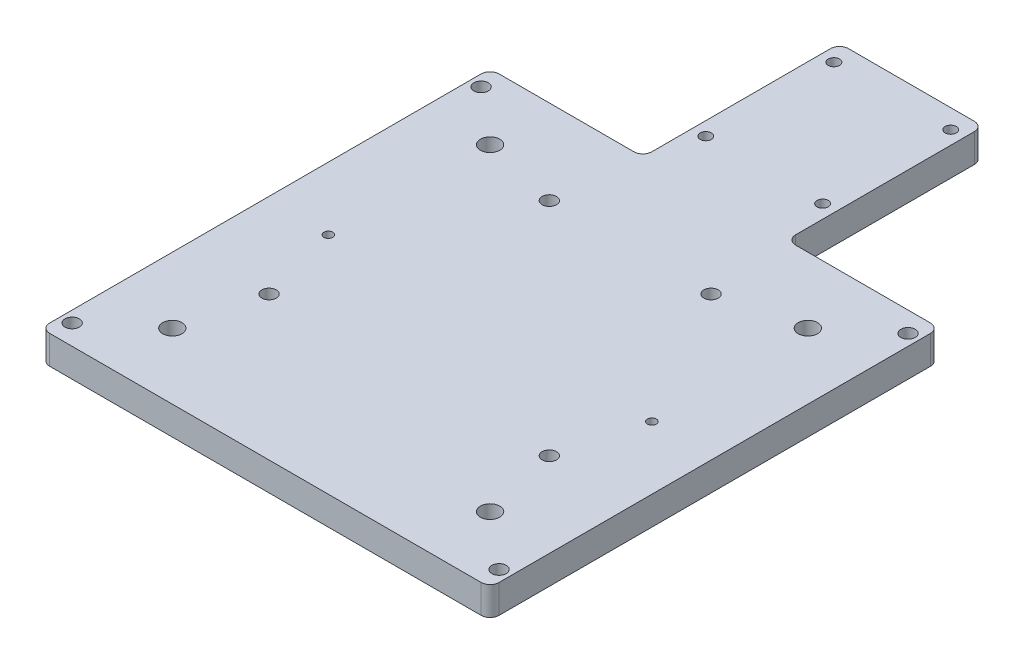
ISO-10303-21;
HEADER;
FILE_DESCRIPTION(('STEP AP214'),'2;1');
FILE_NAME('part.step','',(''),(''),'','','');
FILE_SCHEMA(('AUTOMOTIVE_DESIGN { 1 0 10303 214 1 1 1 1 }'));
ENDSEC;
DATA;
#1=APPLICATION_CONTEXT('core data for automotive mechanical design processes');
#2=APPLICATION_PROTOCOL_DEFINITION('international standard','automotive_design',2000,#1);
#3=PRODUCT_CONTEXT('',#1,'mechanical');
#4=PRODUCT('Part','Part','',(#3));
#5=PRODUCT_RELATED_PRODUCT_CATEGORY('part','',(#4));
#6=PRODUCT_DEFINITION_FORMATION('','',#4);
#7=PRODUCT_DEFINITION_CONTEXT('part definition',#1,'design');
#8=PRODUCT_DEFINITION('design','',#6,#7);
#9=PRODUCT_DEFINITION_SHAPE('','',#8);
#10=(LENGTH_UNIT() NAMED_UNIT(*) SI_UNIT(.MILLI.,.METRE.));
#11=(NAMED_UNIT(*) PLANE_ANGLE_UNIT() SI_UNIT($,.RADIAN.));
#12=(NAMED_UNIT(*) SI_UNIT($,.STERADIAN.) SOLID_ANGLE_UNIT());
#13=UNCERTAINTY_MEASURE_WITH_UNIT(LENGTH_MEASURE(1.E-05),#10,'distance_accuracy_value','');
#14=(GEOMETRIC_REPRESENTATION_CONTEXT(3) GLOBAL_UNCERTAINTY_ASSIGNED_CONTEXT((#13)) GLOBAL_UNIT_ASSIGNED_CONTEXT((#10,
#11,#12)) REPRESENTATION_CONTEXT('',''));
#15=CARTESIAN_POINT('',(0.,0.,0.));
#16=DIRECTION('',(0.,0.,1.));
#17=DIRECTION('',(1.,0.,0.));
#18=AXIS2_PLACEMENT_3D('',#15,#16,#17);
#19=CARTESIAN_POINT('',(-50.,6.35,-50.));
#20=DIRECTION('',(0.,0.,1.));
#21=DIRECTION('',(1.,0.,0.));
#22=AXIS2_PLACEMENT_3D('',#19,#20,#21);
#23=PLANE('',#22);
#24=DIRECTION('',(-1.,0.,0.));
#25=VECTOR('',#24,1.);
#26=CARTESIAN_POINT('',(-50.,6.35,-50.));
#27=LINE('',#26,#25);
#28=CARTESIAN_POINT('',(-18.,6.35,-50.));
#29=VERTEX_POINT('',#28);
#30=CARTESIAN_POINT('',(-48.,6.35,-50.));
#31=VERTEX_POINT('',#30);
#32=EDGE_CURVE('E280',#29,#31,#27,.T.);
#33=ORIENTED_EDGE('',*,*,#32,.F.);
#34=DIRECTION('',(0.,1.,0.));
#35=VECTOR('',#34,1.);
#36=CARTESIAN_POINT('',(-18.,6.35,-50.));
#37=LINE('',#36,#35);
#38=CARTESIAN_POINT('',(-18.,0.,-50.));
#39=VERTEX_POINT('',#38);
#40=EDGE_CURVE('E231',#29,#39,#37,.F.);
#41=ORIENTED_EDGE('',*,*,#40,.T.);
#42=DIRECTION('',(-1.,0.,0.));
#43=VECTOR('',#42,1.);
#44=CARTESIAN_POINT('',(-50.,0.,-50.));
#45=LINE('',#44,#43);
#46=CARTESIAN_POINT('',(-48.,0.,-50.));
#47=VERTEX_POINT('',#46);
#48=EDGE_CURVE('E180',#39,#47,#45,.T.);
#49=ORIENTED_EDGE('',*,*,#48,.T.);
#50=DIRECTION('',(0.,-1.,0.));
#51=VECTOR('',#50,1.);
#52=CARTESIAN_POINT('',(-48.,6.35,-50.));
#53=LINE('',#52,#51);
#54=EDGE_CURVE('E229',#47,#31,#53,.F.);
#55=ORIENTED_EDGE('',*,*,#54,.T.);
#56=EDGE_LOOP('',(#33,#41,#49,#55));
#57=FACE_BOUND('',#56,.T.);
#58=ADVANCED_FACE('F39',(#57),#23,.F.);
#59=CARTESIAN_POINT('',(50.,6.35,50.));
#60=DIRECTION('',(-1.,0.,0.));
#61=DIRECTION('',(0.,0.,1.));
#62=AXIS2_PLACEMENT_3D('',#59,#60,#61);
#63=PLANE('',#62);
#64=DIRECTION('',(0.,0.,-1.));
#65=VECTOR('',#64,1.);
#66=CARTESIAN_POINT('',(50.,6.35,50.));
#67=LINE('',#66,#65);
#68=CARTESIAN_POINT('',(50.,6.35,48.));
#69=VERTEX_POINT('',#68);
#70=CARTESIAN_POINT('',(50.,6.35,-48.));
#71=VERTEX_POINT('',#70);
#72=EDGE_CURVE('E173',#69,#71,#67,.T.);
#73=ORIENTED_EDGE('',*,*,#72,.F.);
#74=DIRECTION('',(0.,-1.,0.));
#75=VECTOR('',#74,1.);
#76=CARTESIAN_POINT('',(50.,6.35,48.));
#77=LINE('',#76,#75);
#78=CARTESIAN_POINT('',(50.,0.,48.));
#79=VERTEX_POINT('',#78);
#80=EDGE_CURVE('E157',#69,#79,#77,.T.);
#81=ORIENTED_EDGE('',*,*,#80,.T.);
#82=DIRECTION('',(0.,0.,-1.));
#83=VECTOR('',#82,1.);
#84=CARTESIAN_POINT('',(50.,0.,50.));
#85=LINE('',#84,#83);
#86=CARTESIAN_POINT('',(50.,0.,-48.));
#87=VERTEX_POINT('',#86);
#88=EDGE_CURVE('E170',#79,#87,#85,.T.);
#89=ORIENTED_EDGE('',*,*,#88,.T.);
#90=DIRECTION('',(0.,-1.,0.));
#91=VECTOR('',#90,1.);
#92=CARTESIAN_POINT('',(50.,6.35,-48.));
#93=LINE('',#92,#91);
#94=EDGE_CURVE('E175',#87,#71,#93,.F.);
#95=ORIENTED_EDGE('',*,*,#94,.T.);
#96=EDGE_LOOP('',(#73,#81,#89,#95));
#97=FACE_BOUND('',#96,.T.);
#98=ADVANCED_FACE('F169',(#97),#63,.F.);
#99=CARTESIAN_POINT('',(48.,0.,-50.));
#100=VERTEX_POINT('',#99);
#101=CARTESIAN_POINT('',(18.,0.,-50.));
#102=VERTEX_POINT('',#101);
#103=EDGE_CURVE('E184',#100,#102,#45,.T.);
#104=ORIENTED_EDGE('',*,*,#103,.T.);
#105=DIRECTION('',(0.,1.,0.));
#106=VECTOR('',#105,1.);
#107=CARTESIAN_POINT('',(18.,6.35,-50.));
#108=LINE('',#107,#106);
#109=CARTESIAN_POINT('',(18.,6.35,-50.));
#110=VERTEX_POINT('',#109);
#111=EDGE_CURVE('E246',#102,#110,#108,.T.);
#112=ORIENTED_EDGE('',*,*,#111,.T.);
#113=CARTESIAN_POINT('',(48.,6.35,-50.));
#114=VERTEX_POINT('',#113);
#115=EDGE_CURVE('E259',#114,#110,#27,.T.);
#116=ORIENTED_EDGE('',*,*,#115,.F.);
#117=DIRECTION('',(0.,-1.,0.));
#118=VECTOR('',#117,1.);
#119=CARTESIAN_POINT('',(48.,6.35,-50.));
#120=LINE('',#119,#118);
#121=EDGE_CURVE('E243',#114,#100,#120,.T.);
#122=ORIENTED_EDGE('',*,*,#121,.T.);
#123=EDGE_LOOP('',(#104,#112,#116,#122));
#124=FACE_BOUND('',#123,.T.);
#125=ADVANCED_FACE('F275',(#124),#23,.F.);
#126=CARTESIAN_POINT('',(-50.,6.35,50.));
#127=DIRECTION('',(1.,0.,0.));
#128=DIRECTION('',(0.,0.,-1.));
#129=AXIS2_PLACEMENT_3D('',#126,#127,#128);
#130=PLANE('',#129);
#131=DIRECTION('',(0.,0.,1.));
#132=VECTOR('',#131,1.);
#133=CARTESIAN_POINT('',(-50.,0.,50.));
#134=LINE('',#133,#132);
#135=CARTESIAN_POINT('',(-50.,0.,-48.));
#136=VERTEX_POINT('',#135);
#137=CARTESIAN_POINT('',(-50.,0.,48.));
#138=VERTEX_POINT('',#137);
#139=EDGE_CURVE('E194',#136,#138,#134,.T.);
#140=ORIENTED_EDGE('',*,*,#139,.T.);
#141=DIRECTION('',(0.,-1.,0.));
#142=VECTOR('',#141,1.);
#143=CARTESIAN_POINT('',(-50.,6.35,48.));
#144=LINE('',#143,#142);
#145=CARTESIAN_POINT('',(-50.,6.35,48.));
#146=VERTEX_POINT('',#145);
#147=EDGE_CURVE('E54',#138,#146,#144,.F.);
#148=ORIENTED_EDGE('',*,*,#147,.T.);
#149=DIRECTION('',(0.,0.,1.));
#150=VECTOR('',#149,1.);
#151=CARTESIAN_POINT('',(-50.,6.35,50.));
#152=LINE('',#151,#150);
#153=CARTESIAN_POINT('',(-50.,6.35,-48.));
#154=VERTEX_POINT('',#153);
#155=EDGE_CURVE('E284',#154,#146,#152,.T.);
#156=ORIENTED_EDGE('',*,*,#155,.F.);
#157=DIRECTION('',(0.,-1.,0.));
#158=VECTOR('',#157,1.);
#159=CARTESIAN_POINT('',(-50.,6.35,-48.));
#160=LINE('',#159,#158);
#161=EDGE_CURVE('E220',#154,#136,#160,.T.);
#162=ORIENTED_EDGE('',*,*,#161,.T.);
#163=EDGE_LOOP('',(#140,#148,#156,#162));
#164=FACE_BOUND('',#163,.T.);
#165=ADVANCED_FACE('F293',(#164),#130,.F.);
#166=CARTESIAN_POINT('',(-50.,6.35,50.));
#167=DIRECTION('',(0.,0.,-1.));
#168=DIRECTION('',(-1.,0.,0.));
#169=AXIS2_PLACEMENT_3D('',#166,#167,#168);
#170=PLANE('',#169);
#171=DIRECTION('',(1.,0.,0.));
#172=VECTOR('',#171,1.);
#173=CARTESIAN_POINT('',(-50.,0.,50.));
#174=LINE('',#173,#172);
#175=CARTESIAN_POINT('',(-48.,0.,50.));
#176=VERTEX_POINT('',#175);
#177=CARTESIAN_POINT('',(48.,0.,50.));
#178=VERTEX_POINT('',#177);
#179=EDGE_CURVE('E196',#176,#178,#174,.T.);
#180=ORIENTED_EDGE('',*,*,#179,.T.);
#181=DIRECTION('',(0.,-1.,0.));
#182=VECTOR('',#181,1.);
#183=CARTESIAN_POINT('',(48.,6.35,50.));
#184=LINE('',#183,#182);
#185=CARTESIAN_POINT('',(48.,6.35,50.));
#186=VERTEX_POINT('',#185);
#187=EDGE_CURVE('E158',#178,#186,#184,.F.);
#188=ORIENTED_EDGE('',*,*,#187,.T.);
#189=DIRECTION('',(1.,0.,0.));
#190=VECTOR('',#189,1.);
#191=CARTESIAN_POINT('',(-50.,6.35,50.));
#192=LINE('',#191,#190);
#193=CARTESIAN_POINT('',(-48.,6.35,50.));
#194=VERTEX_POINT('',#193);
#195=EDGE_CURVE('E190',#194,#186,#192,.T.);
#196=ORIENTED_EDGE('',*,*,#195,.F.);
#197=DIRECTION('',(0.,-1.,0.));
#198=VECTOR('',#197,1.);
#199=CARTESIAN_POINT('',(-48.,6.35,50.));
#200=LINE('',#199,#198);
#201=EDGE_CURVE('E163',#194,#176,#200,.T.);
#202=ORIENTED_EDGE('',*,*,#201,.T.);
#203=EDGE_LOOP('',(#180,#188,#196,#202));
#204=FACE_BOUND('',#203,.T.);
#205=ADVANCED_FACE('F289',(#204),#170,.F.);
#206=CARTESIAN_POINT('',(0.,6.35,0.));
#207=DIRECTION('',(0.,-1.,0.));
#208=DIRECTION('',(0.,0.,-1.));
#209=AXIS2_PLACEMENT_3D('',#206,#207,#208);
#210=PLANE('',#209);
#211=CARTESIAN_POINT('',(-13.,6.35,-89.5));
#212=DIRECTION('',(0.,1.,0.));
#213=DIRECTION('',(0.,0.,1.));
#214=AXIS2_PLACEMENT_3D('',#211,#212,#213);
#215=CIRCLE('',#214,1.24999999999999);
#216=CARTESIAN_POINT('',(-13.,6.35,-88.25));
#217=VERTEX_POINT('',#216);
#218=EDGE_CURVE('E432',#217,#217,#215,.T.);
#219=ORIENTED_EDGE('',*,*,#218,.F.);
#220=EDGE_LOOP('',(#219));
#221=FACE_BOUND('',#220,.T.);
#222=CARTESIAN_POINT('',(13.,6.35,-89.5));
#223=DIRECTION('',(0.,1.,0.));
#224=DIRECTION('',(0.,0.,1.));
#225=AXIS2_PLACEMENT_3D('',#222,#223,#224);
#226=CIRCLE('',#225,1.24999999999999);
#227=CARTESIAN_POINT('',(13.,6.35,-88.25));
#228=VERTEX_POINT('',#227);
#229=EDGE_CURVE('E426',#228,#228,#226,.T.);
#230=ORIENTED_EDGE('',*,*,#229,.F.);
#231=EDGE_LOOP('',(#230));
#232=FACE_BOUND('',#231,.T.);
#233=CARTESIAN_POINT('',(13.,6.35,-61.));
#234=DIRECTION('',(0.,1.,0.));
#235=DIRECTION('',(0.,0.,1.));
#236=AXIS2_PLACEMENT_3D('',#233,#234,#235);
#237=CIRCLE('',#236,1.24999999999999);
#238=CARTESIAN_POINT('',(13.,6.35,-59.75));
#239=VERTEX_POINT('',#238);
#240=EDGE_CURVE('E420',#239,#239,#237,.T.);
#241=ORIENTED_EDGE('',*,*,#240,.F.);
#242=EDGE_LOOP('',(#241));
#243=FACE_BOUND('',#242,.T.);
#244=CARTESIAN_POINT('',(-13.,6.35,-61.));
#245=DIRECTION('',(0.,1.,0.));
#246=DIRECTION('',(0.,0.,1.));
#247=AXIS2_PLACEMENT_3D('',#244,#245,#246);
#248=CIRCLE('',#247,1.24999999999999);
#249=CARTESIAN_POINT('',(-13.,6.35,-59.75));
#250=VERTEX_POINT('',#249);
#251=EDGE_CURVE('E414',#250,#250,#248,.T.);
#252=ORIENTED_EDGE('',*,*,#251,.F.);
#253=EDGE_LOOP('',(#252));
#254=FACE_BOUND('',#253,.T.);
#255=CARTESIAN_POINT('',(-35.355,6.35,35.355));
#256=DIRECTION('',(0.,1.,0.));
#257=DIRECTION('',(0.,0.,1.));
#258=AXIS2_PLACEMENT_3D('',#255,#256,#257);
#259=CIRCLE('',#258,2.15);
#260=CARTESIAN_POINT('',(-35.355,6.35,37.505));
#261=VERTEX_POINT('',#260);
#262=EDGE_CURVE('E408',#261,#261,#259,.T.);
#263=ORIENTED_EDGE('',*,*,#262,.F.);
#264=EDGE_LOOP('',(#263));
#265=FACE_BOUND('',#264,.T.);
#266=CARTESIAN_POINT('',(-35.355,6.35,-35.355));
#267=DIRECTION('',(0.,1.,0.));
#268=DIRECTION('',(0.,0.,1.));
#269=AXIS2_PLACEMENT_3D('',#266,#267,#268);
#270=CIRCLE('',#269,2.15);
#271=CARTESIAN_POINT('',(-35.355,6.35,-33.205));
#272=VERTEX_POINT('',#271);
#273=EDGE_CURVE('E402',#272,#272,#270,.T.);
#274=ORIENTED_EDGE('',*,*,#273,.F.);
#275=EDGE_LOOP('',(#274));
#276=FACE_BOUND('',#275,.T.);
#277=CARTESIAN_POINT('',(35.355,6.35,-35.355));
#278=DIRECTION('',(0.,1.,0.));
#279=DIRECTION('',(0.,0.,1.));
#280=AXIS2_PLACEMENT_3D('',#277,#278,#279);
#281=CIRCLE('',#280,2.15);
#282=CARTESIAN_POINT('',(35.355,6.35,-33.205));
#283=VERTEX_POINT('',#282);
#284=EDGE_CURVE('E396',#283,#283,#281,.T.);
#285=ORIENTED_EDGE('',*,*,#284,.F.);
#286=EDGE_LOOP('',(#285));
#287=FACE_BOUND('',#286,.T.);
#288=CARTESIAN_POINT('',(35.355,6.35,35.355));
#289=DIRECTION('',(0.,1.,0.));
#290=DIRECTION('',(0.,0.,1.));
#291=AXIS2_PLACEMENT_3D('',#288,#289,#290);
#292=CIRCLE('',#291,2.15);
#293=CARTESIAN_POINT('',(35.355,6.35,37.505));
#294=VERTEX_POINT('',#293);
#295=EDGE_CURVE('E390',#294,#294,#292,.T.);
#296=ORIENTED_EDGE('',*,*,#295,.F.);
#297=EDGE_LOOP('',(#296));
#298=FACE_BOUND('',#297,.T.);
#299=CARTESIAN_POINT('',(-47.5,6.35,-45.5));
#300=DIRECTION('',(0.,1.,0.));
#301=DIRECTION('',(0.,0.,1.));
#302=AXIS2_PLACEMENT_3D('',#299,#300,#301);
#303=CIRCLE('',#302,1.6);
#304=CARTESIAN_POINT('',(-47.5,6.35,-43.9));
#305=VERTEX_POINT('',#304);
#306=EDGE_CURVE('E384',#305,#305,#303,.T.);
#307=ORIENTED_EDGE('',*,*,#306,.F.);
#308=EDGE_LOOP('',(#307));
#309=FACE_BOUND('',#308,.T.);
#310=CARTESIAN_POINT('',(47.5,6.35,-45.5));
#311=DIRECTION('',(0.,1.,0.));
#312=DIRECTION('',(0.,0.,1.));
#313=AXIS2_PLACEMENT_3D('',#310,#311,#312);
#314=CIRCLE('',#313,1.6);
#315=CARTESIAN_POINT('',(47.5,6.35,-43.9));
#316=VERTEX_POINT('',#315);
#317=EDGE_CURVE('E378',#316,#316,#314,.T.);
#318=ORIENTED_EDGE('',*,*,#317,.F.);
#319=EDGE_LOOP('',(#318));
#320=FACE_BOUND('',#319,.T.);
#321=CARTESIAN_POINT('',(47.5,6.35,45.5));
#322=DIRECTION('',(0.,1.,0.));
#323=DIRECTION('',(0.,0.,1.));
#324=AXIS2_PLACEMENT_3D('',#321,#322,#323);
#325=CIRCLE('',#324,1.6);
#326=CARTESIAN_POINT('',(47.5,6.35,47.1));
#327=VERTEX_POINT('',#326);
#328=EDGE_CURVE('E372',#327,#327,#325,.T.);
#329=ORIENTED_EDGE('',*,*,#328,.F.);
#330=EDGE_LOOP('',(#329));
#331=FACE_BOUND('',#330,.T.);
#332=CARTESIAN_POINT('',(-47.5,6.35,45.5));
#333=DIRECTION('',(0.,1.,0.));
#334=DIRECTION('',(0.,0.,1.));
#335=AXIS2_PLACEMENT_3D('',#332,#333,#334);
#336=CIRCLE('',#335,1.6);
#337=CARTESIAN_POINT('',(-47.5,6.35,47.1));
#338=VERTEX_POINT('',#337);
#339=EDGE_CURVE('E366',#338,#338,#336,.T.);
#340=ORIENTED_EDGE('',*,*,#339,.F.);
#341=EDGE_LOOP('',(#340));
#342=FACE_BOUND('',#341,.T.);
#343=CARTESIAN_POINT('',(-31.1769145362398,6.35,18.));
#344=DIRECTION('',(0.,1.,0.));
#345=DIRECTION('',(0.,0.,1.));
#346=AXIS2_PLACEMENT_3D('',#343,#344,#345);
#347=CIRCLE('',#346,1.6);
#348=CARTESIAN_POINT('',(-31.1769145362398,6.35,19.6000000000001));
#349=VERTEX_POINT('',#348);
#350=EDGE_CURVE('E360',#349,#349,#347,.T.);
#351=ORIENTED_EDGE('',*,*,#350,.F.);
#352=EDGE_LOOP('',(#351));
#353=FACE_BOUND('',#352,.T.);
#354=CARTESIAN_POINT('',(31.1769145362398,6.35,18.));
#355=DIRECTION('',(0.,1.,0.));
#356=DIRECTION('',(0.,0.,1.));
#357=AXIS2_PLACEMENT_3D('',#354,#355,#356);
#358=CIRCLE('',#357,1.6);
#359=CARTESIAN_POINT('',(31.1769145362398,6.35,19.6));
#360=VERTEX_POINT('',#359);
#361=EDGE_CURVE('E354',#360,#360,#358,.T.);
#362=ORIENTED_EDGE('',*,*,#361,.F.);
#363=EDGE_LOOP('',(#362));
#364=FACE_BOUND('',#363,.T.);
#365=CARTESIAN_POINT('',(18.,6.35,-31.1769145362398));
#366=DIRECTION('',(0.,1.,0.));
#367=DIRECTION('',(0.,0.,1.));
#368=AXIS2_PLACEMENT_3D('',#365,#366,#367);
#369=CIRCLE('',#368,1.6);
#370=CARTESIAN_POINT('',(18.,6.35,-29.5769145362398));
#371=VERTEX_POINT('',#370);
#372=EDGE_CURVE('E348',#371,#371,#369,.T.);
#373=ORIENTED_EDGE('',*,*,#372,.F.);
#374=EDGE_LOOP('',(#373));
#375=FACE_BOUND('',#374,.T.);
#376=CARTESIAN_POINT('',(-17.9999999999999,6.35,-31.1769145362398));
#377=DIRECTION('',(0.,1.,0.));
#378=DIRECTION('',(0.,0.,1.));
#379=AXIS2_PLACEMENT_3D('',#376,#377,#378);
#380=CIRCLE('',#379,1.6);
#381=CARTESIAN_POINT('',(-17.9999999999999,6.35,-29.5769145362398));
#382=VERTEX_POINT('',#381);
#383=EDGE_CURVE('E342',#382,#382,#380,.T.);
#384=ORIENTED_EDGE('',*,*,#383,.F.);
#385=EDGE_LOOP('',(#384));
#386=FACE_BOUND('',#385,.T.);
#387=CARTESIAN_POINT('',(-36.,6.35,0.));
#388=DIRECTION('',(0.,1.,0.));
#389=DIRECTION('',(0.,0.,1.));
#390=AXIS2_PLACEMENT_3D('',#387,#388,#389);
#391=CIRCLE('',#390,0.991869999999997);
#392=CARTESIAN_POINT('',(-36.,6.35,0.991869999999997));
#393=VERTEX_POINT('',#392);
#394=EDGE_CURVE('E335',#393,#393,#391,.T.);
#395=ORIENTED_EDGE('',*,*,#394,.F.);
#396=EDGE_LOOP('',(#395));
#397=FACE_BOUND('',#396,.T.);
#398=CARTESIAN_POINT('',(36.,6.35,0.));
#399=DIRECTION('',(0.,1.,0.));
#400=DIRECTION('',(0.,0.,1.));
#401=AXIS2_PLACEMENT_3D('',#398,#399,#400);
#402=CIRCLE('',#401,0.991869999999997);
#403=CARTESIAN_POINT('',(36.,6.35,0.991869999999997));
#404=VERTEX_POINT('',#403);
#405=EDGE_CURVE('E331',#404,#404,#402,.T.);
#406=ORIENTED_EDGE('',*,*,#405,.F.);
#407=EDGE_LOOP('',(#406));
#408=FACE_BOUND('',#407,.T.);
#409=ORIENTED_EDGE('',*,*,#195,.T.);
#410=CARTESIAN_POINT('',(48.,6.35,48.));
#411=DIRECTION('',(0.,-1.,0.));
#412=DIRECTION('',(0.,0.,-1.));
#413=AXIS2_PLACEMENT_3D('',#410,#411,#412);
#414=CIRCLE('',#413,2.);
#415=EDGE_CURVE('E218',#186,#69,#414,.F.);
#416=ORIENTED_EDGE('',*,*,#415,.T.);
#417=ORIENTED_EDGE('',*,*,#72,.T.);
#418=CARTESIAN_POINT('',(48.,6.35,-48.));
#419=DIRECTION('',(0.,-1.,0.));
#420=DIRECTION('',(0.,0.,-1.));
#421=AXIS2_PLACEMENT_3D('',#418,#419,#420);
#422=CIRCLE('',#421,2.);
#423=EDGE_CURVE('E210',#71,#114,#422,.F.);
#424=ORIENTED_EDGE('',*,*,#423,.T.);
#425=ORIENTED_EDGE('',*,*,#115,.T.);
#426=CARTESIAN_POINT('',(18.,6.35,-52.));
#427=DIRECTION('',(0.,-1.,0.));
#428=DIRECTION('',(0.,0.,-1.));
#429=AXIS2_PLACEMENT_3D('',#426,#427,#428);
#430=CIRCLE('',#429,2.);
#431=CARTESIAN_POINT('',(16.,6.35,-52.));
#432=VERTEX_POINT('',#431);
#433=EDGE_CURVE('E47',#110,#432,#430,.T.);
#434=ORIENTED_EDGE('',*,*,#433,.T.);
#435=DIRECTION('',(0.,0.,-1.));
#436=VECTOR('',#435,1.);
#437=CARTESIAN_POINT('',(16.,6.35,-93.75));
#438=LINE('',#437,#436);
#439=CARTESIAN_POINT('',(16.,6.35,-91.75));
#440=VERTEX_POINT('',#439);
#441=EDGE_CURVE('E257',#432,#440,#438,.T.);
#442=ORIENTED_EDGE('',*,*,#441,.T.);
#443=CARTESIAN_POINT('',(14.,6.35,-91.75));
#444=DIRECTION('',(0.,-1.,0.));
#445=DIRECTION('',(0.,0.,-1.));
#446=AXIS2_PLACEMENT_3D('',#443,#444,#445);
#447=CIRCLE('',#446,2.);
#448=CARTESIAN_POINT('',(14.,6.35,-93.75));
#449=VERTEX_POINT('',#448);
#450=EDGE_CURVE('E212',#440,#449,#447,.F.);
#451=ORIENTED_EDGE('',*,*,#450,.T.);
#452=DIRECTION('',(-1.,0.,0.));
#453=VECTOR('',#452,1.);
#454=CARTESIAN_POINT('',(-16.,6.35,-93.75));
#455=LINE('',#454,#453);
#456=CARTESIAN_POINT('',(-14.,6.35,-93.75));
#457=VERTEX_POINT('',#456);
#458=EDGE_CURVE('E268',#449,#457,#455,.T.);
#459=ORIENTED_EDGE('',*,*,#458,.T.);
#460=CARTESIAN_POINT('',(-14.,6.35,-91.75));
#461=DIRECTION('',(0.,-1.,0.));
#462=DIRECTION('',(0.,0.,-1.));
#463=AXIS2_PLACEMENT_3D('',#460,#461,#462);
#464=CIRCLE('',#463,2.);
#465=CARTESIAN_POINT('',(-16.,6.35,-91.75));
#466=VERTEX_POINT('',#465);
#467=EDGE_CURVE('E214',#457,#466,#464,.F.);
#468=ORIENTED_EDGE('',*,*,#467,.T.);
#469=DIRECTION('',(0.,0.,1.));
#470=VECTOR('',#469,1.);
#471=CARTESIAN_POINT('',(-16.,6.35,-50.));
#472=LINE('',#471,#470);
#473=CARTESIAN_POINT('',(-16.,6.35,-52.));
#474=VERTEX_POINT('',#473);
#475=EDGE_CURVE('E312',#466,#474,#472,.T.);
#476=ORIENTED_EDGE('',*,*,#475,.T.);
#477=CARTESIAN_POINT('',(-18.,6.35,-52.));
#478=DIRECTION('',(0.,-1.,0.));
#479=DIRECTION('',(0.,0.,-1.));
#480=AXIS2_PLACEMENT_3D('',#477,#478,#479);
#481=CIRCLE('',#480,2.);
#482=EDGE_CURVE('E249',#474,#29,#481,.T.);
#483=ORIENTED_EDGE('',*,*,#482,.T.);
#484=ORIENTED_EDGE('',*,*,#32,.T.);
#485=CARTESIAN_POINT('',(-48.,6.35,-48.));
#486=DIRECTION('',(0.,-1.,0.));
#487=DIRECTION('',(0.,0.,-1.));
#488=AXIS2_PLACEMENT_3D('',#485,#486,#487);
#489=CIRCLE('',#488,2.);
#490=EDGE_CURVE('E61',#31,#154,#489,.F.);
#491=ORIENTED_EDGE('',*,*,#490,.T.);
#492=ORIENTED_EDGE('',*,*,#155,.T.);
#493=CARTESIAN_POINT('',(-48.,6.35,48.));
#494=DIRECTION('',(0.,-1.,0.));
#495=DIRECTION('',(0.,0.,-1.));
#496=AXIS2_PLACEMENT_3D('',#493,#494,#495);
#497=CIRCLE('',#496,2.);
#498=EDGE_CURVE('E216',#146,#194,#497,.F.);
#499=ORIENTED_EDGE('',*,*,#498,.T.);
#500=EDGE_LOOP('',(#409,#416,#417,#424,#425,#434,#442,#451,#459,#468,#476,#483,#484,#491,#492,#499));
#501=FACE_BOUND('',#500,.T.);
#502=ADVANCED_FACE('F256',(#221,#232,#243,#254,#265,#276,#287,#298,#309,#320,#331,#342,#353,
#364,#375,#386,#397,#408,#501),#210,.F.);
#503=CARTESIAN_POINT('',(0.,0.,0.));
#504=DIRECTION('',(0.,-1.,0.));
#505=DIRECTION('',(0.,0.,-1.));
#506=AXIS2_PLACEMENT_3D('',#503,#504,#505);
#507=PLANE('',#506);
#508=CARTESIAN_POINT('',(-13.,0.,-89.5));
#509=DIRECTION('',(0.,1.,0.));
#510=DIRECTION('',(0.,0.,1.));
#511=AXIS2_PLACEMENT_3D('',#508,#509,#510);
#512=CIRCLE('',#511,1.24999999999999);
#513=CARTESIAN_POINT('',(-13.,0.,-88.25));
#514=VERTEX_POINT('',#513);
#515=EDGE_CURVE('E429',#514,#514,#512,.T.);
#516=ORIENTED_EDGE('',*,*,#515,.T.);
#517=EDGE_LOOP('',(#516));
#518=FACE_BOUND('',#517,.T.);
#519=CARTESIAN_POINT('',(13.,0.,-89.5));
#520=DIRECTION('',(0.,1.,0.));
#521=DIRECTION('',(0.,0.,1.));
#522=AXIS2_PLACEMENT_3D('',#519,#520,#521);
#523=CIRCLE('',#522,1.24999999999999);
#524=CARTESIAN_POINT('',(13.,0.,-88.25));
#525=VERTEX_POINT('',#524);
#526=EDGE_CURVE('E423',#525,#525,#523,.T.);
#527=ORIENTED_EDGE('',*,*,#526,.T.);
#528=EDGE_LOOP('',(#527));
#529=FACE_BOUND('',#528,.T.);
#530=CARTESIAN_POINT('',(13.,0.,-61.));
#531=DIRECTION('',(0.,1.,0.));
#532=DIRECTION('',(0.,0.,1.));
#533=AXIS2_PLACEMENT_3D('',#530,#531,#532);
#534=CIRCLE('',#533,1.24999999999999);
#535=CARTESIAN_POINT('',(13.,0.,-59.75));
#536=VERTEX_POINT('',#535);
#537=EDGE_CURVE('E417',#536,#536,#534,.T.);
#538=ORIENTED_EDGE('',*,*,#537,.T.);
#539=EDGE_LOOP('',(#538));
#540=FACE_BOUND('',#539,.T.);
#541=CARTESIAN_POINT('',(-13.,0.,-61.));
#542=DIRECTION('',(0.,1.,0.));
#543=DIRECTION('',(0.,0.,1.));
#544=AXIS2_PLACEMENT_3D('',#541,#542,#543);
#545=CIRCLE('',#544,1.24999999999999);
#546=CARTESIAN_POINT('',(-13.,0.,-59.75));
#547=VERTEX_POINT('',#546);
#548=EDGE_CURVE('E411',#547,#547,#545,.T.);
#549=ORIENTED_EDGE('',*,*,#548,.T.);
#550=EDGE_LOOP('',(#549));
#551=FACE_BOUND('',#550,.T.);
#552=CARTESIAN_POINT('',(-35.355,0.,35.355));
#553=DIRECTION('',(0.,1.,0.));
#554=DIRECTION('',(0.,0.,1.));
#555=AXIS2_PLACEMENT_3D('',#552,#553,#554);
#556=CIRCLE('',#555,2.15);
#557=CARTESIAN_POINT('',(-35.355,0.,37.505));
#558=VERTEX_POINT('',#557);
#559=EDGE_CURVE('E405',#558,#558,#556,.T.);
#560=ORIENTED_EDGE('',*,*,#559,.T.);
#561=EDGE_LOOP('',(#560));
#562=FACE_BOUND('',#561,.T.);
#563=CARTESIAN_POINT('',(-35.355,0.,-35.355));
#564=DIRECTION('',(0.,1.,0.));
#565=DIRECTION('',(0.,0.,1.));
#566=AXIS2_PLACEMENT_3D('',#563,#564,#565);
#567=CIRCLE('',#566,2.15);
#568=CARTESIAN_POINT('',(-35.355,0.,-33.205));
#569=VERTEX_POINT('',#568);
#570=EDGE_CURVE('E399',#569,#569,#567,.T.);
#571=ORIENTED_EDGE('',*,*,#570,.T.);
#572=EDGE_LOOP('',(#571));
#573=FACE_BOUND('',#572,.T.);
#574=CARTESIAN_POINT('',(35.355,0.,-35.355));
#575=DIRECTION('',(0.,1.,0.));
#576=DIRECTION('',(0.,0.,1.));
#577=AXIS2_PLACEMENT_3D('',#574,#575,#576);
#578=CIRCLE('',#577,2.15);
#579=CARTESIAN_POINT('',(35.355,0.,-33.205));
#580=VERTEX_POINT('',#579);
#581=EDGE_CURVE('E393',#580,#580,#578,.T.);
#582=ORIENTED_EDGE('',*,*,#581,.T.);
#583=EDGE_LOOP('',(#582));
#584=FACE_BOUND('',#583,.T.);
#585=CARTESIAN_POINT('',(35.355,0.,35.355));
#586=DIRECTION('',(0.,1.,0.));
#587=DIRECTION('',(0.,0.,1.));
#588=AXIS2_PLACEMENT_3D('',#585,#586,#587);
#589=CIRCLE('',#588,2.15);
#590=CARTESIAN_POINT('',(35.355,0.,37.505));
#591=VERTEX_POINT('',#590);
#592=EDGE_CURVE('E387',#591,#591,#589,.T.);
#593=ORIENTED_EDGE('',*,*,#592,.T.);
#594=EDGE_LOOP('',(#593));
#595=FACE_BOUND('',#594,.T.);
#596=CARTESIAN_POINT('',(-47.5,0.,-45.5));
#597=DIRECTION('',(0.,1.,0.));
#598=DIRECTION('',(0.,0.,1.));
#599=AXIS2_PLACEMENT_3D('',#596,#597,#598);
#600=CIRCLE('',#599,1.6);
#601=CARTESIAN_POINT('',(-47.5,0.,-43.9));
#602=VERTEX_POINT('',#601);
#603=EDGE_CURVE('E381',#602,#602,#600,.T.);
#604=ORIENTED_EDGE('',*,*,#603,.T.);
#605=EDGE_LOOP('',(#604));
#606=FACE_BOUND('',#605,.T.);
#607=CARTESIAN_POINT('',(47.5,0.,-45.5));
#608=DIRECTION('',(0.,1.,0.));
#609=DIRECTION('',(0.,0.,1.));
#610=AXIS2_PLACEMENT_3D('',#607,#608,#609);
#611=CIRCLE('',#610,1.6);
#612=CARTESIAN_POINT('',(47.5,0.,-43.9));
#613=VERTEX_POINT('',#612);
#614=EDGE_CURVE('E375',#613,#613,#611,.T.);
#615=ORIENTED_EDGE('',*,*,#614,.T.);
#616=EDGE_LOOP('',(#615));
#617=FACE_BOUND('',#616,.T.);
#618=CARTESIAN_POINT('',(47.5,0.,45.5));
#619=DIRECTION('',(0.,1.,0.));
#620=DIRECTION('',(0.,0.,1.));
#621=AXIS2_PLACEMENT_3D('',#618,#619,#620);
#622=CIRCLE('',#621,1.6);
#623=CARTESIAN_POINT('',(47.5,0.,47.1));
#624=VERTEX_POINT('',#623);
#625=EDGE_CURVE('E369',#624,#624,#622,.T.);
#626=ORIENTED_EDGE('',*,*,#625,.T.);
#627=EDGE_LOOP('',(#626));
#628=FACE_BOUND('',#627,.T.);
#629=CARTESIAN_POINT('',(-47.5,0.,45.5));
#630=DIRECTION('',(0.,1.,0.));
#631=DIRECTION('',(0.,0.,1.));
#632=AXIS2_PLACEMENT_3D('',#629,#630,#631);
#633=CIRCLE('',#632,1.6);
#634=CARTESIAN_POINT('',(-47.5,0.,47.1));
#635=VERTEX_POINT('',#634);
#636=EDGE_CURVE('E363',#635,#635,#633,.T.);
#637=ORIENTED_EDGE('',*,*,#636,.T.);
#638=EDGE_LOOP('',(#637));
#639=FACE_BOUND('',#638,.T.);
#640=CARTESIAN_POINT('',(-31.1769145362398,0.,18.));
#641=DIRECTION('',(0.,1.,0.));
#642=DIRECTION('',(0.,0.,1.));
#643=AXIS2_PLACEMENT_3D('',#640,#641,#642);
#644=CIRCLE('',#643,1.6);
#645=CARTESIAN_POINT('',(-31.1769145362398,0.,19.6));
#646=VERTEX_POINT('',#645);
#647=EDGE_CURVE('E357',#646,#646,#644,.T.);
#648=ORIENTED_EDGE('',*,*,#647,.T.);
#649=EDGE_LOOP('',(#648));
#650=FACE_BOUND('',#649,.T.);
#651=CARTESIAN_POINT('',(31.1769145362398,0.,18.));
#652=DIRECTION('',(0.,1.,0.));
#653=DIRECTION('',(0.,0.,1.));
#654=AXIS2_PLACEMENT_3D('',#651,#652,#653);
#655=CIRCLE('',#654,1.6);
#656=CARTESIAN_POINT('',(31.1769145362398,0.,19.6));
#657=VERTEX_POINT('',#656);
#658=EDGE_CURVE('E351',#657,#657,#655,.T.);
#659=ORIENTED_EDGE('',*,*,#658,.T.);
#660=EDGE_LOOP('',(#659));
#661=FACE_BOUND('',#660,.T.);
#662=CARTESIAN_POINT('',(18.,0.,-31.1769145362398));
#663=DIRECTION('',(0.,1.,0.));
#664=DIRECTION('',(0.,0.,1.));
#665=AXIS2_PLACEMENT_3D('',#662,#663,#664);
#666=CIRCLE('',#665,1.6);
#667=CARTESIAN_POINT('',(18.,0.,-29.5769145362398));
#668=VERTEX_POINT('',#667);
#669=EDGE_CURVE('E345',#668,#668,#666,.T.);
#670=ORIENTED_EDGE('',*,*,#669,.T.);
#671=EDGE_LOOP('',(#670));
#672=FACE_BOUND('',#671,.T.);
#673=CARTESIAN_POINT('',(-17.9999999999999,0.,-31.1769145362398));
#674=DIRECTION('',(0.,1.,0.));
#675=DIRECTION('',(0.,0.,1.));
#676=AXIS2_PLACEMENT_3D('',#673,#674,#675);
#677=CIRCLE('',#676,1.6);
#678=CARTESIAN_POINT('',(-17.9999999999999,0.,-29.5769145362398));
#679=VERTEX_POINT('',#678);
#680=EDGE_CURVE('E332',#679,#679,#677,.T.);
#681=ORIENTED_EDGE('',*,*,#680,.T.);
#682=EDGE_LOOP('',(#681));
#683=FACE_BOUND('',#682,.T.);
#684=CARTESIAN_POINT('',(-36.,0.,0.));
#685=DIRECTION('',(0.,1.,0.));
#686=DIRECTION('',(0.,0.,1.));
#687=AXIS2_PLACEMENT_3D('',#684,#685,#686);
#688=CIRCLE('',#687,0.991869999999997);
#689=CARTESIAN_POINT('',(-36.,0.,0.991869999999997));
#690=VERTEX_POINT('',#689);
#691=EDGE_CURVE('E269',#690,#690,#688,.T.);
#692=ORIENTED_EDGE('',*,*,#691,.T.);
#693=EDGE_LOOP('',(#692));
#694=FACE_BOUND('',#693,.T.);
#695=CARTESIAN_POINT('',(36.,0.,0.));
#696=DIRECTION('',(0.,1.,0.));
#697=DIRECTION('',(0.,0.,1.));
#698=AXIS2_PLACEMENT_3D('',#695,#696,#697);
#699=CIRCLE('',#698,0.991869999999997);
#700=CARTESIAN_POINT('',(36.,0.,0.991869999999997));
#701=VERTEX_POINT('',#700);
#702=EDGE_CURVE('E328',#701,#701,#699,.T.);
#703=ORIENTED_EDGE('',*,*,#702,.T.);
#704=EDGE_LOOP('',(#703));
#705=FACE_BOUND('',#704,.T.);
#706=ORIENTED_EDGE('',*,*,#88,.F.);
#707=CARTESIAN_POINT('',(48.,0.,48.));
#708=DIRECTION('',(0.,-1.,0.));
#709=DIRECTION('',(0.,0.,-1.));
#710=AXIS2_PLACEMENT_3D('',#707,#708,#709);
#711=CIRCLE('',#710,2.);
#712=EDGE_CURVE('E153',#79,#178,#711,.T.);
#713=ORIENTED_EDGE('',*,*,#712,.T.);
#714=ORIENTED_EDGE('',*,*,#179,.F.);
#715=CARTESIAN_POINT('',(-48.,0.,48.));
#716=DIRECTION('',(0.,-1.,0.));
#717=DIRECTION('',(0.,0.,-1.));
#718=AXIS2_PLACEMENT_3D('',#715,#716,#717);
#719=CIRCLE('',#718,2.);
#720=EDGE_CURVE('E164',#176,#138,#719,.T.);
#721=ORIENTED_EDGE('',*,*,#720,.T.);
#722=ORIENTED_EDGE('',*,*,#139,.F.);
#723=CARTESIAN_POINT('',(-48.,0.,-48.));
#724=DIRECTION('',(0.,-1.,0.));
#725=DIRECTION('',(0.,0.,-1.));
#726=AXIS2_PLACEMENT_3D('',#723,#724,#725);
#727=CIRCLE('',#726,2.);
#728=EDGE_CURVE('E174',#136,#47,#727,.T.);
#729=ORIENTED_EDGE('',*,*,#728,.T.);
#730=ORIENTED_EDGE('',*,*,#48,.F.);
#731=CARTESIAN_POINT('',(-18.,0.,-52.));
#732=DIRECTION('',(0.,-1.,0.));
#733=DIRECTION('',(0.,0.,-1.));
#734=AXIS2_PLACEMENT_3D('',#731,#732,#733);
#735=CIRCLE('',#734,2.);
#736=CARTESIAN_POINT('',(-16.,0.,-52.));
#737=VERTEX_POINT('',#736);
#738=EDGE_CURVE('E251',#39,#737,#735,.F.);
#739=ORIENTED_EDGE('',*,*,#738,.T.);
#740=DIRECTION('',(0.,0.,1.));
#741=VECTOR('',#740,1.);
#742=CARTESIAN_POINT('',(-16.,0.,-50.));
#743=LINE('',#742,#741);
#744=CARTESIAN_POINT('',(-16.,0.,-91.75));
#745=VERTEX_POINT('',#744);
#746=EDGE_CURVE('E181',#745,#737,#743,.T.);
#747=ORIENTED_EDGE('',*,*,#746,.F.);
#748=CARTESIAN_POINT('',(-14.,0.,-91.75));
#749=DIRECTION('',(0.,-1.,0.));
#750=DIRECTION('',(0.,0.,-1.));
#751=AXIS2_PLACEMENT_3D('',#748,#749,#750);
#752=CIRCLE('',#751,2.);
#753=CARTESIAN_POINT('',(-14.,0.,-93.75));
#754=VERTEX_POINT('',#753);
#755=EDGE_CURVE('E203',#745,#754,#752,.T.);
#756=ORIENTED_EDGE('',*,*,#755,.T.);
#757=DIRECTION('',(-1.,0.,0.));
#758=VECTOR('',#757,1.);
#759=CARTESIAN_POINT('',(-16.,0.,-93.75));
#760=LINE('',#759,#758);
#761=CARTESIAN_POINT('',(14.,0.,-93.75));
#762=VERTEX_POINT('',#761);
#763=EDGE_CURVE('E187',#762,#754,#760,.T.);
#764=ORIENTED_EDGE('',*,*,#763,.F.);
#765=CARTESIAN_POINT('',(14.,0.,-91.75));
#766=DIRECTION('',(0.,-1.,0.));
#767=DIRECTION('',(0.,0.,-1.));
#768=AXIS2_PLACEMENT_3D('',#765,#766,#767);
#769=CIRCLE('',#768,2.);
#770=CARTESIAN_POINT('',(16.,0.,-91.75));
#771=VERTEX_POINT('',#770);
#772=EDGE_CURVE('E201',#762,#771,#769,.T.);
#773=ORIENTED_EDGE('',*,*,#772,.T.);
#774=DIRECTION('',(0.,0.,-1.));
#775=VECTOR('',#774,1.);
#776=CARTESIAN_POINT('',(16.,0.,-93.75));
#777=LINE('',#776,#775);
#778=CARTESIAN_POINT('',(16.,0.,-52.));
#779=VERTEX_POINT('',#778);
#780=EDGE_CURVE('E273',#779,#771,#777,.T.);
#781=ORIENTED_EDGE('',*,*,#780,.F.);
#782=CARTESIAN_POINT('',(18.,0.,-52.));
#783=DIRECTION('',(0.,-1.,0.));
#784=DIRECTION('',(0.,0.,-1.));
#785=AXIS2_PLACEMENT_3D('',#782,#783,#784);
#786=CIRCLE('',#785,2.);
#787=EDGE_CURVE('E11',#779,#102,#786,.F.);
#788=ORIENTED_EDGE('',*,*,#787,.T.);
#789=ORIENTED_EDGE('',*,*,#103,.F.);
#790=CARTESIAN_POINT('',(48.,0.,-48.));
#791=DIRECTION('',(0.,-1.,0.));
#792=DIRECTION('',(0.,0.,-1.));
#793=AXIS2_PLACEMENT_3D('',#790,#791,#792);
#794=CIRCLE('',#793,2.);
#795=EDGE_CURVE('E179',#100,#87,#794,.T.);
#796=ORIENTED_EDGE('',*,*,#795,.T.);
#797=EDGE_LOOP('',(#706,#713,#714,#721,#722,#729,#730,#739,#747,#756,#764,#773,#781,#788,#789,#796));
#798=FACE_BOUND('',#797,.T.);
#799=ADVANCED_FACE('F177',(#518,#529,#540,#551,#562,#573,#584,#595,#606,#617,#628,#639,#650,
#661,#672,#683,#694,#705,#798),#507,.T.);
#800=CARTESIAN_POINT('',(16.,-54.203897461345,-93.75));
#801=DIRECTION('',(1.,0.,0.));
#802=DIRECTION('',(0.,0.,-1.));
#803=AXIS2_PLACEMENT_3D('',#800,#801,#802);
#804=PLANE('',#803);
#805=ORIENTED_EDGE('',*,*,#780,.T.);
#806=DIRECTION('',(0.,1.,0.));
#807=VECTOR('',#806,1.);
#808=CARTESIAN_POINT('',(16.,-54.203897461345,-91.75));
#809=LINE('',#808,#807);
#810=EDGE_CURVE('E240',#771,#440,#809,.T.);
#811=ORIENTED_EDGE('',*,*,#810,.T.);
#812=ORIENTED_EDGE('',*,*,#441,.F.);
#813=DIRECTION('',(0.,1.,0.));
#814=VECTOR('',#813,1.);
#815=CARTESIAN_POINT('',(16.,-54.203897461345,-52.));
#816=LINE('',#815,#814);
#817=EDGE_CURVE('E238',#432,#779,#816,.F.);
#818=ORIENTED_EDGE('',*,*,#817,.T.);
#819=EDGE_LOOP('',(#805,#811,#812,#818));
#820=FACE_BOUND('',#819,.T.);
#821=ADVANCED_FACE('F265',(#820),#804,.T.);
#822=CARTESIAN_POINT('',(-16.,-54.203897461345,-93.75));
#823=DIRECTION('',(0.,0.,-1.));
#824=DIRECTION('',(-1.,0.,0.));
#825=AXIS2_PLACEMENT_3D('',#822,#823,#824);
#826=PLANE('',#825);
#827=ORIENTED_EDGE('',*,*,#763,.T.);
#828=DIRECTION('',(0.,1.,0.));
#829=VECTOR('',#828,1.);
#830=CARTESIAN_POINT('',(-14.,-54.203897461345,-93.75));
#831=LINE('',#830,#829);
#832=EDGE_CURVE('E235',#754,#457,#831,.T.);
#833=ORIENTED_EDGE('',*,*,#832,.T.);
#834=ORIENTED_EDGE('',*,*,#458,.F.);
#835=DIRECTION('',(0.,1.,0.));
#836=VECTOR('',#835,1.);
#837=CARTESIAN_POINT('',(14.,-54.203897461345,-93.75));
#838=LINE('',#837,#836);
#839=EDGE_CURVE('E233',#449,#762,#838,.F.);
#840=ORIENTED_EDGE('',*,*,#839,.T.);
#841=EDGE_LOOP('',(#827,#833,#834,#840));
#842=FACE_BOUND('',#841,.T.);
#843=ADVANCED_FACE('F320',(#842),#826,.T.);
#844=CARTESIAN_POINT('',(-16.,-54.203897461345,-50.));
#845=DIRECTION('',(-1.,0.,0.));
#846=DIRECTION('',(0.,0.,1.));
#847=AXIS2_PLACEMENT_3D('',#844,#845,#846);
#848=PLANE('',#847);
#849=ORIENTED_EDGE('',*,*,#746,.T.);
#850=DIRECTION('',(0.,1.,0.));
#851=VECTOR('',#850,1.);
#852=CARTESIAN_POINT('',(-16.,-54.203897461345,-52.));
#853=LINE('',#852,#851);
#854=EDGE_CURVE('E226',#737,#474,#853,.T.);
#855=ORIENTED_EDGE('',*,*,#854,.T.);
#856=ORIENTED_EDGE('',*,*,#475,.F.);
#857=DIRECTION('',(0.,1.,0.));
#858=VECTOR('',#857,1.);
#859=CARTESIAN_POINT('',(-16.,-54.203897461345,-91.75));
#860=LINE('',#859,#858);
#861=EDGE_CURVE('E224',#466,#745,#860,.F.);
#862=ORIENTED_EDGE('',*,*,#861,.T.);
#863=EDGE_LOOP('',(#849,#855,#856,#862));
#864=FACE_BOUND('',#863,.T.);
#865=ADVANCED_FACE('F308',(#864),#848,.T.);
#866=CARTESIAN_POINT('',(36.,0.,0.));
#867=DIRECTION('',(0.,1.,0.));
#868=DIRECTION('',(0.,0.,1.));
#869=AXIS2_PLACEMENT_3D('',#866,#867,#868);
#870=CYLINDRICAL_SURFACE('',#869,0.991869999999997);
#871=ORIENTED_EDGE('',*,*,#702,.F.);
#872=EDGE_LOOP('',(#871));
#873=FACE_BOUND('',#872,.T.);
#874=ORIENTED_EDGE('',*,*,#405,.T.);
#875=EDGE_LOOP('',(#874));
#876=FACE_BOUND('',#875,.T.);
#877=ADVANCED_FACE('F475',(#873,#876),#870,.F.);
#878=CARTESIAN_POINT('',(-36.,0.,0.));
#879=DIRECTION('',(0.,1.,0.));
#880=DIRECTION('',(0.,0.,1.));
#881=AXIS2_PLACEMENT_3D('',#878,#879,#880);
#882=CYLINDRICAL_SURFACE('',#881,0.991869999999997);
#883=ORIENTED_EDGE('',*,*,#691,.F.);
#884=EDGE_LOOP('',(#883));
#885=FACE_BOUND('',#884,.T.);
#886=ORIENTED_EDGE('',*,*,#394,.T.);
#887=EDGE_LOOP('',(#886));
#888=FACE_BOUND('',#887,.T.);
#889=ADVANCED_FACE('F477',(#885,#888),#882,.F.);
#890=CARTESIAN_POINT('',(-17.9999999999999,6.35,-31.1769145362398));
#891=DIRECTION('',(0.,1.,0.));
#892=DIRECTION('',(0.,0.,1.));
#893=AXIS2_PLACEMENT_3D('',#890,#891,#892);
#894=CYLINDRICAL_SURFACE('',#893,1.6);
#895=ORIENTED_EDGE('',*,*,#680,.F.);
#896=EDGE_LOOP('',(#895));
#897=FACE_BOUND('',#896,.T.);
#898=ORIENTED_EDGE('',*,*,#383,.T.);
#899=EDGE_LOOP('',(#898));
#900=FACE_BOUND('',#899,.T.);
#901=ADVANCED_FACE('F483',(#897,#900),#894,.F.);
#902=CARTESIAN_POINT('',(18.,6.35,-31.1769145362398));
#903=DIRECTION('',(0.,1.,0.));
#904=DIRECTION('',(0.,0.,1.));
#905=AXIS2_PLACEMENT_3D('',#902,#903,#904);
#906=CYLINDRICAL_SURFACE('',#905,1.6);
#907=ORIENTED_EDGE('',*,*,#669,.F.);
#908=EDGE_LOOP('',(#907));
#909=FACE_BOUND('',#908,.T.);
#910=ORIENTED_EDGE('',*,*,#372,.T.);
#911=EDGE_LOOP('',(#910));
#912=FACE_BOUND('',#911,.T.);
#913=ADVANCED_FACE('F709',(#909,#912),#906,.F.);
#914=CARTESIAN_POINT('',(31.1769145362398,6.35,18.));
#915=DIRECTION('',(0.,1.,0.));
#916=DIRECTION('',(0.,0.,1.));
#917=AXIS2_PLACEMENT_3D('',#914,#915,#916);
#918=CYLINDRICAL_SURFACE('',#917,1.6);
#919=ORIENTED_EDGE('',*,*,#658,.F.);
#920=EDGE_LOOP('',(#919));
#921=FACE_BOUND('',#920,.T.);
#922=ORIENTED_EDGE('',*,*,#361,.T.);
#923=EDGE_LOOP('',(#922));
#924=FACE_BOUND('',#923,.T.);
#925=ADVANCED_FACE('F700',(#921,#924),#918,.F.);
#926=CARTESIAN_POINT('',(-31.1769145362398,6.35,18.));
#927=DIRECTION('',(0.,1.,0.));
#928=DIRECTION('',(0.,0.,1.));
#929=AXIS2_PLACEMENT_3D('',#926,#927,#928);
#930=CYLINDRICAL_SURFACE('',#929,1.6);
#931=ORIENTED_EDGE('',*,*,#647,.F.);
#932=EDGE_LOOP('',(#931));
#933=FACE_BOUND('',#932,.T.);
#934=ORIENTED_EDGE('',*,*,#350,.T.);
#935=EDGE_LOOP('',(#934));
#936=FACE_BOUND('',#935,.T.);
#937=ADVANCED_FACE('F691',(#933,#936),#930,.F.);
#938=CARTESIAN_POINT('',(-47.5,6.35,45.5));
#939=DIRECTION('',(0.,1.,0.));
#940=DIRECTION('',(0.,0.,1.));
#941=AXIS2_PLACEMENT_3D('',#938,#939,#940);
#942=CYLINDRICAL_SURFACE('',#941,1.6);
#943=ORIENTED_EDGE('',*,*,#636,.F.);
#944=EDGE_LOOP('',(#943));
#945=FACE_BOUND('',#944,.T.);
#946=ORIENTED_EDGE('',*,*,#339,.T.);
#947=EDGE_LOOP('',(#946));
#948=FACE_BOUND('',#947,.T.);
#949=ADVANCED_FACE('F682',(#945,#948),#942,.F.);
#950=CARTESIAN_POINT('',(47.5,6.35,45.5));
#951=DIRECTION('',(0.,1.,0.));
#952=DIRECTION('',(0.,0.,1.));
#953=AXIS2_PLACEMENT_3D('',#950,#951,#952);
#954=CYLINDRICAL_SURFACE('',#953,1.6);
#955=ORIENTED_EDGE('',*,*,#625,.F.);
#956=EDGE_LOOP('',(#955));
#957=FACE_BOUND('',#956,.T.);
#958=ORIENTED_EDGE('',*,*,#328,.T.);
#959=EDGE_LOOP('',(#958));
#960=FACE_BOUND('',#959,.T.);
#961=ADVANCED_FACE('F673',(#957,#960),#954,.F.);
#962=CARTESIAN_POINT('',(47.5,6.35,-45.5));
#963=DIRECTION('',(0.,1.,0.));
#964=DIRECTION('',(0.,0.,1.));
#965=AXIS2_PLACEMENT_3D('',#962,#963,#964);
#966=CYLINDRICAL_SURFACE('',#965,1.6);
#967=ORIENTED_EDGE('',*,*,#614,.F.);
#968=EDGE_LOOP('',(#967));
#969=FACE_BOUND('',#968,.T.);
#970=ORIENTED_EDGE('',*,*,#317,.T.);
#971=EDGE_LOOP('',(#970));
#972=FACE_BOUND('',#971,.T.);
#973=ADVANCED_FACE('F664',(#969,#972),#966,.F.);
#974=CARTESIAN_POINT('',(-47.5,6.35,-45.5));
#975=DIRECTION('',(0.,1.,0.));
#976=DIRECTION('',(0.,0.,1.));
#977=AXIS2_PLACEMENT_3D('',#974,#975,#976);
#978=CYLINDRICAL_SURFACE('',#977,1.6);
#979=ORIENTED_EDGE('',*,*,#603,.F.);
#980=EDGE_LOOP('',(#979));
#981=FACE_BOUND('',#980,.T.);
#982=ORIENTED_EDGE('',*,*,#306,.T.);
#983=EDGE_LOOP('',(#982));
#984=FACE_BOUND('',#983,.T.);
#985=ADVANCED_FACE('F655',(#981,#984),#978,.F.);
#986=CARTESIAN_POINT('',(35.355,6.35,35.355));
#987=DIRECTION('',(0.,1.,0.));
#988=DIRECTION('',(0.,0.,1.));
#989=AXIS2_PLACEMENT_3D('',#986,#987,#988);
#990=CYLINDRICAL_SURFACE('',#989,2.15);
#991=ORIENTED_EDGE('',*,*,#592,.F.);
#992=EDGE_LOOP('',(#991));
#993=FACE_BOUND('',#992,.T.);
#994=ORIENTED_EDGE('',*,*,#295,.T.);
#995=EDGE_LOOP('',(#994));
#996=FACE_BOUND('',#995,.T.);
#997=ADVANCED_FACE('F646',(#993,#996),#990,.F.);
#998=CARTESIAN_POINT('',(35.355,6.35,-35.355));
#999=DIRECTION('',(0.,1.,0.));
#1000=DIRECTION('',(0.,0.,1.));
#1001=AXIS2_PLACEMENT_3D('',#998,#999,#1000);
#1002=CYLINDRICAL_SURFACE('',#1001,2.15);
#1003=ORIENTED_EDGE('',*,*,#581,.F.);
#1004=EDGE_LOOP('',(#1003));
#1005=FACE_BOUND('',#1004,.T.);
#1006=ORIENTED_EDGE('',*,*,#284,.T.);
#1007=EDGE_LOOP('',(#1006));
#1008=FACE_BOUND('',#1007,.T.);
#1009=ADVANCED_FACE('F637',(#1005,#1008),#1002,.F.);
#1010=CARTESIAN_POINT('',(-35.355,6.35,-35.355));
#1011=DIRECTION('',(0.,1.,0.));
#1012=DIRECTION('',(0.,0.,1.));
#1013=AXIS2_PLACEMENT_3D('',#1010,#1011,#1012);
#1014=CYLINDRICAL_SURFACE('',#1013,2.15);
#1015=ORIENTED_EDGE('',*,*,#570,.F.);
#1016=EDGE_LOOP('',(#1015));
#1017=FACE_BOUND('',#1016,.T.);
#1018=ORIENTED_EDGE('',*,*,#273,.T.);
#1019=EDGE_LOOP('',(#1018));
#1020=FACE_BOUND('',#1019,.T.);
#1021=ADVANCED_FACE('F628',(#1017,#1020),#1014,.F.);
#1022=CARTESIAN_POINT('',(-35.355,6.35,35.355));
#1023=DIRECTION('',(0.,1.,0.));
#1024=DIRECTION('',(0.,0.,1.));
#1025=AXIS2_PLACEMENT_3D('',#1022,#1023,#1024);
#1026=CYLINDRICAL_SURFACE('',#1025,2.15);
#1027=ORIENTED_EDGE('',*,*,#559,.F.);
#1028=EDGE_LOOP('',(#1027));
#1029=FACE_BOUND('',#1028,.T.);
#1030=ORIENTED_EDGE('',*,*,#262,.T.);
#1031=EDGE_LOOP('',(#1030));
#1032=FACE_BOUND('',#1031,.T.);
#1033=ADVANCED_FACE('F619',(#1029,#1032),#1026,.F.);
#1034=CARTESIAN_POINT('',(-13.,6.35,-61.));
#1035=DIRECTION('',(0.,1.,0.));
#1036=DIRECTION('',(0.,0.,1.));
#1037=AXIS2_PLACEMENT_3D('',#1034,#1035,#1036);
#1038=CYLINDRICAL_SURFACE('',#1037,1.24999999999999);
#1039=ORIENTED_EDGE('',*,*,#548,.F.);
#1040=EDGE_LOOP('',(#1039));
#1041=FACE_BOUND('',#1040,.T.);
#1042=ORIENTED_EDGE('',*,*,#251,.T.);
#1043=EDGE_LOOP('',(#1042));
#1044=FACE_BOUND('',#1043,.T.);
#1045=ADVANCED_FACE('F610',(#1041,#1044),#1038,.F.);
#1046=CARTESIAN_POINT('',(13.,6.35,-61.));
#1047=DIRECTION('',(0.,1.,0.));
#1048=DIRECTION('',(0.,0.,1.));
#1049=AXIS2_PLACEMENT_3D('',#1046,#1047,#1048);
#1050=CYLINDRICAL_SURFACE('',#1049,1.24999999999999);
#1051=ORIENTED_EDGE('',*,*,#537,.F.);
#1052=EDGE_LOOP('',(#1051));
#1053=FACE_BOUND('',#1052,.T.);
#1054=ORIENTED_EDGE('',*,*,#240,.T.);
#1055=EDGE_LOOP('',(#1054));
#1056=FACE_BOUND('',#1055,.T.);
#1057=ADVANCED_FACE('F601',(#1053,#1056),#1050,.F.);
#1058=CARTESIAN_POINT('',(13.,6.35,-89.5));
#1059=DIRECTION('',(0.,1.,0.));
#1060=DIRECTION('',(0.,0.,1.));
#1061=AXIS2_PLACEMENT_3D('',#1058,#1059,#1060);
#1062=CYLINDRICAL_SURFACE('',#1061,1.24999999999999);
#1063=ORIENTED_EDGE('',*,*,#526,.F.);
#1064=EDGE_LOOP('',(#1063));
#1065=FACE_BOUND('',#1064,.T.);
#1066=ORIENTED_EDGE('',*,*,#229,.T.);
#1067=EDGE_LOOP('',(#1066));
#1068=FACE_BOUND('',#1067,.T.);
#1069=ADVANCED_FACE('F592',(#1065,#1068),#1062,.F.);
#1070=CARTESIAN_POINT('',(-13.,6.35,-89.5));
#1071=DIRECTION('',(0.,1.,0.));
#1072=DIRECTION('',(0.,0.,1.));
#1073=AXIS2_PLACEMENT_3D('',#1070,#1071,#1072);
#1074=CYLINDRICAL_SURFACE('',#1073,1.24999999999999);
#1075=ORIENTED_EDGE('',*,*,#515,.F.);
#1076=EDGE_LOOP('',(#1075));
#1077=FACE_BOUND('',#1076,.T.);
#1078=ORIENTED_EDGE('',*,*,#218,.T.);
#1079=EDGE_LOOP('',(#1078));
#1080=FACE_BOUND('',#1079,.T.);
#1081=ADVANCED_FACE('F436',(#1077,#1080),#1074,.F.);
#1082=CARTESIAN_POINT('',(48.,6.35,48.));
#1083=DIRECTION('',(0.,-1.,0.));
#1084=DIRECTION('',(0.,0.,-1.));
#1085=AXIS2_PLACEMENT_3D('',#1082,#1083,#1084);
#1086=CYLINDRICAL_SURFACE('',#1085,2.);
#1087=ORIENTED_EDGE('',*,*,#415,.F.);
#1088=ORIENTED_EDGE('',*,*,#187,.F.);
#1089=ORIENTED_EDGE('',*,*,#712,.F.);
#1090=ORIENTED_EDGE('',*,*,#80,.F.);
#1091=EDGE_LOOP('',(#1087,#1088,#1089,#1090));
#1092=FACE_BOUND('',#1091,.T.);
#1093=ADVANCED_FACE('F156',(#1092),#1086,.T.);
#1094=CARTESIAN_POINT('',(-48.,6.35,48.));
#1095=DIRECTION('',(0.,-1.,0.));
#1096=DIRECTION('',(0.,0.,-1.));
#1097=AXIS2_PLACEMENT_3D('',#1094,#1095,#1096);
#1098=CYLINDRICAL_SURFACE('',#1097,2.);
#1099=ORIENTED_EDGE('',*,*,#498,.F.);
#1100=ORIENTED_EDGE('',*,*,#147,.F.);
#1101=ORIENTED_EDGE('',*,*,#720,.F.);
#1102=ORIENTED_EDGE('',*,*,#201,.F.);
#1103=EDGE_LOOP('',(#1099,#1100,#1101,#1102));
#1104=FACE_BOUND('',#1103,.T.);
#1105=ADVANCED_FACE('F291',(#1104),#1098,.T.);
#1106=CARTESIAN_POINT('',(-18.,-54.203897461345,-52.));
#1107=DIRECTION('',(0.,1.,0.));
#1108=DIRECTION('',(0.,0.,1.));
#1109=AXIS2_PLACEMENT_3D('',#1106,#1107,#1108);
#1110=CYLINDRICAL_SURFACE('',#1109,2.);
#1111=ORIENTED_EDGE('',*,*,#738,.F.);
#1112=ORIENTED_EDGE('',*,*,#40,.F.);
#1113=ORIENTED_EDGE('',*,*,#482,.F.);
#1114=ORIENTED_EDGE('',*,*,#854,.F.);
#1115=EDGE_LOOP('',(#1111,#1112,#1113,#1114));
#1116=FACE_BOUND('',#1115,.T.);
#1117=ADVANCED_FACE('F303',(#1116),#1110,.F.);
#1118=CARTESIAN_POINT('',(-14.,-54.203897461345,-91.75));
#1119=DIRECTION('',(0.,1.,0.));
#1120=DIRECTION('',(0.,0.,1.));
#1121=AXIS2_PLACEMENT_3D('',#1118,#1119,#1120);
#1122=CYLINDRICAL_SURFACE('',#1121,2.);
#1123=ORIENTED_EDGE('',*,*,#755,.F.);
#1124=ORIENTED_EDGE('',*,*,#861,.F.);
#1125=ORIENTED_EDGE('',*,*,#467,.F.);
#1126=ORIENTED_EDGE('',*,*,#832,.F.);
#1127=EDGE_LOOP('',(#1123,#1124,#1125,#1126));
#1128=FACE_BOUND('',#1127,.T.);
#1129=ADVANCED_FACE('F314',(#1128),#1122,.T.);
#1130=CARTESIAN_POINT('',(14.,-54.203897461345,-91.75));
#1131=DIRECTION('',(0.,1.,0.));
#1132=DIRECTION('',(0.,0.,1.));
#1133=AXIS2_PLACEMENT_3D('',#1130,#1131,#1132);
#1134=CYLINDRICAL_SURFACE('',#1133,2.);
#1135=ORIENTED_EDGE('',*,*,#772,.F.);
#1136=ORIENTED_EDGE('',*,*,#839,.F.);
#1137=ORIENTED_EDGE('',*,*,#450,.F.);
#1138=ORIENTED_EDGE('',*,*,#810,.F.);
#1139=EDGE_LOOP('',(#1135,#1136,#1137,#1138));
#1140=FACE_BOUND('',#1139,.T.);
#1141=ADVANCED_FACE('F550',(#1140),#1134,.T.);
#1142=CARTESIAN_POINT('',(18.,6.35,-52.));
#1143=DIRECTION('',(0.,1.,0.));
#1144=DIRECTION('',(0.,0.,1.));
#1145=AXIS2_PLACEMENT_3D('',#1142,#1143,#1144);
#1146=CYLINDRICAL_SURFACE('',#1145,2.);
#1147=ORIENTED_EDGE('',*,*,#787,.F.);
#1148=ORIENTED_EDGE('',*,*,#817,.F.);
#1149=ORIENTED_EDGE('',*,*,#433,.F.);
#1150=ORIENTED_EDGE('',*,*,#111,.F.);
#1151=EDGE_LOOP('',(#1147,#1148,#1149,#1150));
#1152=FACE_BOUND('',#1151,.T.);
#1153=ADVANCED_FACE('F272',(#1152),#1146,.F.);
#1154=CARTESIAN_POINT('',(48.,6.35,-48.));
#1155=DIRECTION('',(0.,-1.,0.));
#1156=DIRECTION('',(0.,0.,-1.));
#1157=AXIS2_PLACEMENT_3D('',#1154,#1155,#1156);
#1158=CYLINDRICAL_SURFACE('',#1157,2.);
#1159=ORIENTED_EDGE('',*,*,#423,.F.);
#1160=ORIENTED_EDGE('',*,*,#94,.F.);
#1161=ORIENTED_EDGE('',*,*,#795,.F.);
#1162=ORIENTED_EDGE('',*,*,#121,.F.);
#1163=EDGE_LOOP('',(#1159,#1160,#1161,#1162));
#1164=FACE_BOUND('',#1163,.T.);
#1165=ADVANCED_FACE('F279',(#1164),#1158,.T.);
#1166=CARTESIAN_POINT('',(-48.,6.35,-48.));
#1167=DIRECTION('',(0.,-1.,0.));
#1168=DIRECTION('',(0.,0.,-1.));
#1169=AXIS2_PLACEMENT_3D('',#1166,#1167,#1168);
#1170=CYLINDRICAL_SURFACE('',#1169,2.);
#1171=ORIENTED_EDGE('',*,*,#490,.F.);
#1172=ORIENTED_EDGE('',*,*,#54,.F.);
#1173=ORIENTED_EDGE('',*,*,#728,.F.);
#1174=ORIENTED_EDGE('',*,*,#161,.F.);
#1175=EDGE_LOOP('',(#1171,#1172,#1173,#1174));
#1176=FACE_BOUND('',#1175,.T.);
#1177=ADVANCED_FACE('F41',(#1176),#1170,.T.);
#1178=CLOSED_SHELL('',(#58,#98,#125,#165,#205,#502,#799,#821,#843,#865,#877,#889,#901,#913,#925,
#937,#949,#961,#973,#985,#997,#1009,#1021,#1033,#1045,#1057,#1069,#1081,#1093,#1105,#1117,#1129,
#1141,#1153,#1165,#1177));
#1179=MANIFOLD_SOLID_BREP('B2',#1178);
#1180=ADVANCED_BREP_SHAPE_REPRESENTATION('',(#18,#1179),#14);
#1181=SHAPE_DEFINITION_REPRESENTATION(#9,#1180);
ENDSEC;
END-ISO-10303-21;
